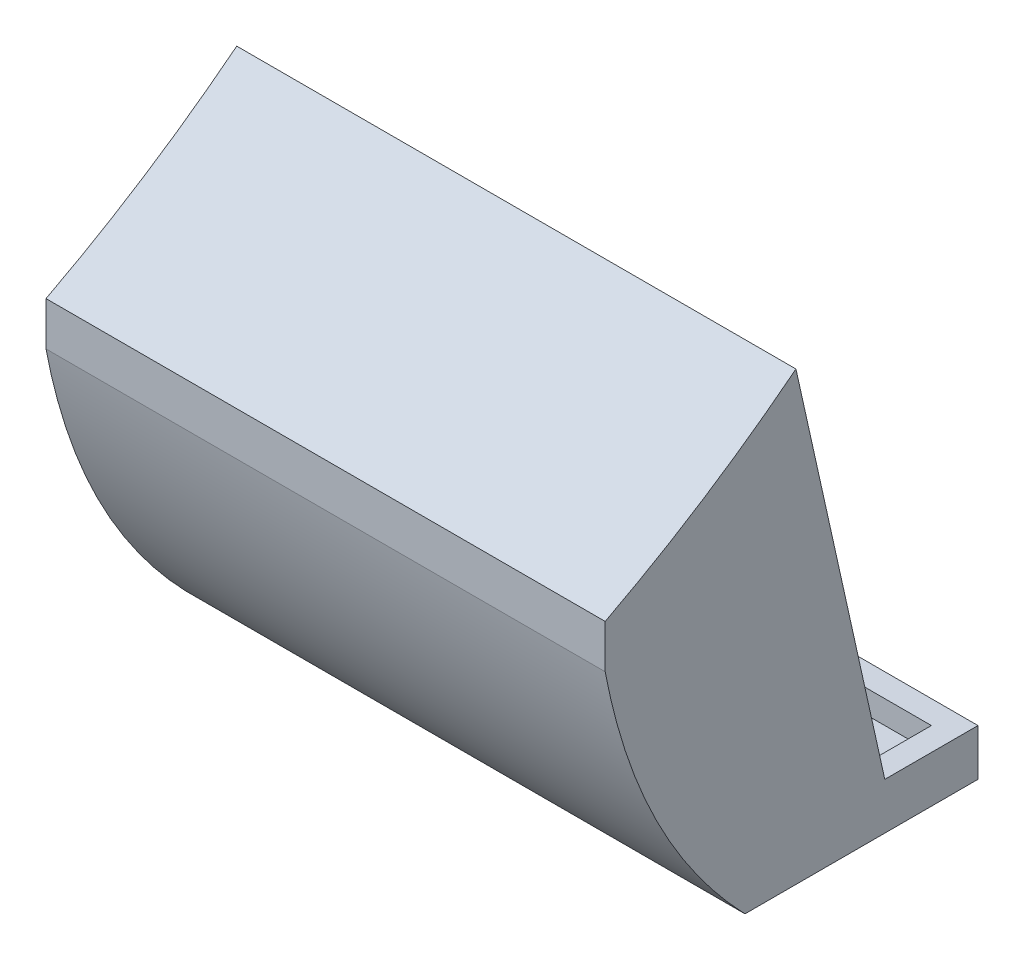
ISO-10303-21;
HEADER;
FILE_DESCRIPTION(('STEP AP214'),'2;1');
FILE_NAME('part.step','',(''),(''),'','','');
FILE_SCHEMA(('AUTOMOTIVE_DESIGN { 1 0 10303 214 1 1 1 1 }'));
ENDSEC;
DATA;
#1=APPLICATION_CONTEXT('core data for automotive mechanical design processes');
#2=APPLICATION_PROTOCOL_DEFINITION('international standard','automotive_design',2000,#1);
#3=PRODUCT_CONTEXT('',#1,'mechanical');
#4=PRODUCT('Part','Part','',(#3));
#5=PRODUCT_RELATED_PRODUCT_CATEGORY('part','',(#4));
#6=PRODUCT_DEFINITION_FORMATION('','',#4);
#7=PRODUCT_DEFINITION_CONTEXT('part definition',#1,'design');
#8=PRODUCT_DEFINITION('design','',#6,#7);
#9=PRODUCT_DEFINITION_SHAPE('','',#8);
#10=(LENGTH_UNIT() NAMED_UNIT(*) SI_UNIT(.MILLI.,.METRE.));
#11=(NAMED_UNIT(*) PLANE_ANGLE_UNIT() SI_UNIT($,.RADIAN.));
#12=(NAMED_UNIT(*) SI_UNIT($,.STERADIAN.) SOLID_ANGLE_UNIT());
#13=UNCERTAINTY_MEASURE_WITH_UNIT(LENGTH_MEASURE(1.E-05),#10,'distance_accuracy_value','');
#14=(GEOMETRIC_REPRESENTATION_CONTEXT(3) GLOBAL_UNCERTAINTY_ASSIGNED_CONTEXT((#13)) GLOBAL_UNIT_ASSIGNED_CONTEXT((#10,
#11,#12)) REPRESENTATION_CONTEXT('',''));
#15=CARTESIAN_POINT('',(0.,0.,0.));
#16=DIRECTION('',(0.,0.,1.));
#17=DIRECTION('',(1.,0.,0.));
#18=AXIS2_PLACEMENT_3D('',#15,#16,#17);
#19=CARTESIAN_POINT('',(0.,10.,-80.));
#20=DIRECTION('',(0.,-1.,0.));
#21=DIRECTION('',(0.,0.,-1.));
#22=AXIS2_PLACEMENT_3D('',#19,#20,#21);
#23=PLANE('',#22);
#24=DIRECTION('',(0.,0.,-1.));
#25=VECTOR('',#24,1.);
#26=CARTESIAN_POINT('',(115.,10.,-80.));
#27=LINE('',#26,#25);
#28=CARTESIAN_POINT('',(115.,9.99999999999999,-60.));
#29=VERTEX_POINT('',#28);
#30=CARTESIAN_POINT('',(115.,10.,-75.));
#31=VERTEX_POINT('',#30);
#32=EDGE_CURVE('E221',#29,#31,#27,.T.);
#33=ORIENTED_EDGE('',*,*,#32,.F.);
#34=DIRECTION('',(1.,0.,0.));
#35=VECTOR('',#34,1.);
#36=CARTESIAN_POINT('',(0.,9.99999999999999,-60.));
#37=LINE('',#36,#35);
#38=CARTESIAN_POINT('',(120.,9.99999999999999,-60.));
#39=VERTEX_POINT('',#38);
#40=EDGE_CURVE('E257',#29,#39,#37,.T.);
#41=ORIENTED_EDGE('',*,*,#40,.T.);
#42=DIRECTION('',(0.,0.,-1.));
#43=VECTOR('',#42,1.);
#44=CARTESIAN_POINT('',(120.,10.,-80.));
#45=LINE('',#44,#43);
#46=CARTESIAN_POINT('',(120.,10.,-80.));
#47=VERTEX_POINT('',#46);
#48=EDGE_CURVE('E254',#39,#47,#45,.T.);
#49=ORIENTED_EDGE('',*,*,#48,.T.);
#50=DIRECTION('',(1.,0.,0.));
#51=VECTOR('',#50,1.);
#52=CARTESIAN_POINT('',(0.,10.,-80.));
#53=LINE('',#52,#51);
#54=CARTESIAN_POINT('',(0.,10.,-80.));
#55=VERTEX_POINT('',#54);
#56=EDGE_CURVE('E242',#55,#47,#53,.T.);
#57=ORIENTED_EDGE('',*,*,#56,.F.);
#58=DIRECTION('',(0.,0.,-1.));
#59=VECTOR('',#58,1.);
#60=CARTESIAN_POINT('',(0.,10.,-80.));
#61=LINE('',#60,#59);
#62=CARTESIAN_POINT('',(0.,9.99999999999999,-60.));
#63=VERTEX_POINT('',#62);
#64=EDGE_CURVE('E253',#63,#55,#61,.T.);
#65=ORIENTED_EDGE('',*,*,#64,.F.);
#66=CARTESIAN_POINT('',(5.,9.99999999999999,-60.));
#67=VERTEX_POINT('',#66);
#68=EDGE_CURVE('E263',#63,#67,#37,.T.);
#69=ORIENTED_EDGE('',*,*,#68,.T.);
#70=DIRECTION('',(0.,0.,-1.));
#71=VECTOR('',#70,1.);
#72=CARTESIAN_POINT('',(5.,9.99999999999998,0.));
#73=LINE('',#72,#71);
#74=CARTESIAN_POINT('',(5.,10.,-75.));
#75=VERTEX_POINT('',#74);
#76=EDGE_CURVE('E220',#67,#75,#73,.T.);
#77=ORIENTED_EDGE('',*,*,#76,.T.);
#78=DIRECTION('',(1.,0.,0.));
#79=VECTOR('',#78,1.);
#80=CARTESIAN_POINT('',(0.,10.,-75.));
#81=LINE('',#80,#79);
#82=EDGE_CURVE('E159',#75,#31,#81,.T.);
#83=ORIENTED_EDGE('',*,*,#82,.T.);
#84=EDGE_LOOP('',(#33,#41,#49,#57,#65,#69,#77,#83));
#85=FACE_BOUND('',#84,.T.);
#86=ADVANCED_FACE('F33',(#85),#23,.F.);
#87=CARTESIAN_POINT('',(0.,100.,0.));
#88=DIRECTION('',(1.,0.,0.));
#89=DIRECTION('',(0.,0.,-1.));
#90=AXIS2_PLACEMENT_3D('',#87,#88,#89);
#91=PLANE('',#90);
#92=DIRECTION('',(0.,-1.,0.));
#93=VECTOR('',#92,1.);
#94=CARTESIAN_POINT('',(0.,100.,0.));
#95=LINE('',#94,#93);
#96=CARTESIAN_POINT('',(0.,69.3487481065839,0.));
#97=VERTEX_POINT('',#96);
#98=CARTESIAN_POINT('',(0.,60.,0.));
#99=VERTEX_POINT('',#98);
#100=EDGE_CURVE('E41',#97,#99,#95,.T.);
#101=ORIENTED_EDGE('',*,*,#100,.F.);
#102=CARTESIAN_POINT('',(0.,300.,120.));
#103=DIRECTION('',(1.,0.,0.));
#104=DIRECTION('',(0.,0.,-1.));
#105=AXIS2_PLACEMENT_3D('',#102,#103,#104);
#106=CIRCLE('',#105,260.);
#107=CARTESIAN_POINT('',(0.,95.7941195384905,-40.9346401025577));
#108=VERTEX_POINT('',#107);
#109=EDGE_CURVE('E230',#97,#108,#106,.T.);
#110=ORIENTED_EDGE('',*,*,#109,.T.);
#111=DIRECTION('',(0.,-0.976187060183953,-0.216930457818656));
#112=VECTOR('',#111,1.);
#113=CARTESIAN_POINT('',(0.,100.,-40.));
#114=LINE('',#113,#112);
#115=EDGE_CURVE('E251',#108,#63,#114,.T.);
#116=ORIENTED_EDGE('',*,*,#115,.T.);
#117=ORIENTED_EDGE('',*,*,#64,.T.);
#118=DIRECTION('',(0.,-1.,0.));
#119=VECTOR('',#118,1.);
#120=CARTESIAN_POINT('',(0.,100.,-80.));
#121=LINE('',#120,#119);
#122=CARTESIAN_POINT('',(0.,0.,-80.));
#123=VERTEX_POINT('',#122);
#124=EDGE_CURVE('E274',#55,#123,#121,.T.);
#125=ORIENTED_EDGE('',*,*,#124,.T.);
#126=DIRECTION('',(0.,0.,1.));
#127=VECTOR('',#126,1.);
#128=CARTESIAN_POINT('',(0.,0.,0.));
#129=LINE('',#128,#127);
#130=CARTESIAN_POINT('',(0.,0.,-30.));
#131=VERTEX_POINT('',#130);
#132=EDGE_CURVE('E248',#123,#131,#129,.T.);
#133=ORIENTED_EDGE('',*,*,#132,.T.);
#134=CARTESIAN_POINT('',(0.,0.,-30.));
#135=CARTESIAN_POINT('',(0.,24.0537588250058,-6.79745445101633));
#136=CARTESIAN_POINT('',(0.,60.,0.));
#137=B_SPLINE_CURVE_WITH_KNOTS('',2,(#134,#135,#136),.UNSPECIFIED.,.F.,.F.,(3,3),(0.,
0.9272023084187),.UNSPECIFIED.);
#138=EDGE_CURVE('E189',#131,#99,#137,.T.);
#139=ORIENTED_EDGE('',*,*,#138,.T.);
#140=EDGE_LOOP('',(#101,#110,#116,#117,#125,#133,#139));
#141=FACE_BOUND('',#140,.T.);
#142=ADVANCED_FACE('F35',(#141),#91,.F.);
#143=CARTESIAN_POINT('',(0.,100.,0.));
#144=DIRECTION('',(0.,0.,-1.));
#145=DIRECTION('',(-1.,0.,0.));
#146=AXIS2_PLACEMENT_3D('',#143,#144,#145);
#147=PLANE('',#146);
#148=DIRECTION('',(0.,-1.,0.));
#149=VECTOR('',#148,1.);
#150=CARTESIAN_POINT('',(120.,100.,0.));
#151=LINE('',#150,#149);
#152=CARTESIAN_POINT('',(120.,69.3487481065839,0.));
#153=VERTEX_POINT('',#152);
#154=CARTESIAN_POINT('',(120.,60.,0.));
#155=VERTEX_POINT('',#154);
#156=EDGE_CURVE('E278',#153,#155,#151,.T.);
#157=ORIENTED_EDGE('',*,*,#156,.F.);
#158=DIRECTION('',(1.,0.,0.));
#159=VECTOR('',#158,1.);
#160=CARTESIAN_POINT('',(0.,69.348748106584,0.));
#161=LINE('',#160,#159);
#162=EDGE_CURVE('E233',#153,#97,#161,.F.);
#163=ORIENTED_EDGE('',*,*,#162,.T.);
#164=ORIENTED_EDGE('',*,*,#100,.T.);
#165=DIRECTION('',(1.,0.,0.));
#166=VECTOR('',#165,1.);
#167=CARTESIAN_POINT('',(0.,60.,0.));
#168=LINE('',#167,#166);
#169=EDGE_CURVE('E194',#99,#155,#168,.T.);
#170=ORIENTED_EDGE('',*,*,#169,.T.);
#171=EDGE_LOOP('',(#157,#163,#164,#170));
#172=FACE_BOUND('',#171,.T.);
#173=ADVANCED_FACE('F283',(#172),#147,.F.);
#174=CARTESIAN_POINT('',(120.,100.,0.));
#175=DIRECTION('',(-1.,0.,0.));
#176=DIRECTION('',(0.,0.,1.));
#177=AXIS2_PLACEMENT_3D('',#174,#175,#176);
#178=PLANE('',#177);
#179=DIRECTION('',(0.,-0.976187060183953,-0.216930457818656));
#180=VECTOR('',#179,1.);
#181=CARTESIAN_POINT('',(120.,100.,-40.));
#182=LINE('',#181,#180);
#183=CARTESIAN_POINT('',(120.,95.7941195384905,-40.9346401025577));
#184=VERTEX_POINT('',#183);
#185=EDGE_CURVE('E237',#184,#39,#182,.T.);
#186=ORIENTED_EDGE('',*,*,#185,.F.);
#187=CARTESIAN_POINT('',(120.,300.,120.));
#188=DIRECTION('',(1.,0.,0.));
#189=DIRECTION('',(0.,0.,-1.));
#190=AXIS2_PLACEMENT_3D('',#187,#188,#189);
#191=CIRCLE('',#190,260.);
#192=EDGE_CURVE('E56',#153,#184,#191,.T.);
#193=ORIENTED_EDGE('',*,*,#192,.F.);
#194=ORIENTED_EDGE('',*,*,#156,.T.);
#195=CARTESIAN_POINT('',(120.,0.,-30.));
#196=CARTESIAN_POINT('',(120.,24.0537588250058,-6.79745445101633));
#197=CARTESIAN_POINT('',(120.,60.,0.));
#198=B_SPLINE_CURVE_WITH_KNOTS('',2,(#195,#196,#197),.UNSPECIFIED.,.F.,.F.,(3,3),(0.,
0.9272023084187),.UNSPECIFIED.);
#199=CARTESIAN_POINT('',(120.,0.,-30.));
#200=VERTEX_POINT('',#199);
#201=EDGE_CURVE('E195',#200,#155,#198,.T.);
#202=ORIENTED_EDGE('',*,*,#201,.F.);
#203=DIRECTION('',(0.,0.,-1.));
#204=VECTOR('',#203,1.);
#205=CARTESIAN_POINT('',(120.,0.,0.));
#206=LINE('',#205,#204);
#207=CARTESIAN_POINT('',(120.,0.,-80.));
#208=VERTEX_POINT('',#207);
#209=EDGE_CURVE('E268',#200,#208,#206,.T.);
#210=ORIENTED_EDGE('',*,*,#209,.T.);
#211=DIRECTION('',(0.,-1.,0.));
#212=VECTOR('',#211,1.);
#213=CARTESIAN_POINT('',(120.,100.,-80.));
#214=LINE('',#213,#212);
#215=EDGE_CURVE('E276',#47,#208,#214,.T.);
#216=ORIENTED_EDGE('',*,*,#215,.F.);
#217=ORIENTED_EDGE('',*,*,#48,.F.);
#218=EDGE_LOOP('',(#186,#193,#194,#202,#210,#216,#217));
#219=FACE_BOUND('',#218,.T.);
#220=ADVANCED_FACE('F294',(#219),#178,.F.);
#221=CARTESIAN_POINT('',(0.,100.,-80.));
#222=DIRECTION('',(0.,0.,1.));
#223=DIRECTION('',(1.,0.,0.));
#224=AXIS2_PLACEMENT_3D('',#221,#222,#223);
#225=PLANE('',#224);
#226=ORIENTED_EDGE('',*,*,#124,.F.);
#227=ORIENTED_EDGE('',*,*,#56,.T.);
#228=ORIENTED_EDGE('',*,*,#215,.T.);
#229=DIRECTION('',(-1.,0.,0.));
#230=VECTOR('',#229,1.);
#231=CARTESIAN_POINT('',(0.,0.,-80.));
#232=LINE('',#231,#230);
#233=EDGE_CURVE('E271',#208,#123,#232,.T.);
#234=ORIENTED_EDGE('',*,*,#233,.T.);
#235=EDGE_LOOP('',(#226,#227,#228,#234));
#236=FACE_BOUND('',#235,.T.);
#237=ADVANCED_FACE('F307',(#236),#225,.F.);
#238=CARTESIAN_POINT('',(0.,0.,0.));
#239=DIRECTION('',(0.,-1.,0.));
#240=DIRECTION('',(0.,0.,-1.));
#241=AXIS2_PLACEMENT_3D('',#238,#239,#240);
#242=PLANE('',#241);
#243=DIRECTION('',(1.,0.,0.));
#244=VECTOR('',#243,1.);
#245=CARTESIAN_POINT('',(0.,0.,-30.));
#246=LINE('',#245,#244);
#247=EDGE_CURVE('E243',#131,#200,#246,.T.);
#248=ORIENTED_EDGE('',*,*,#247,.F.);
#249=ORIENTED_EDGE('',*,*,#132,.F.);
#250=ORIENTED_EDGE('',*,*,#233,.F.);
#251=ORIENTED_EDGE('',*,*,#209,.F.);
#252=EDGE_LOOP('',(#248,#249,#250,#251));
#253=FACE_BOUND('',#252,.T.);
#254=ADVANCED_FACE('F187',(#253),#242,.T.);
#255=DIRECTION('',(1.,0.,0.));
#256=VECTOR('',#255,1.);
#257=SURFACE_OF_LINEAR_EXTRUSION('',#137,#256);
#258=ORIENTED_EDGE('',*,*,#201,.T.);
#259=ORIENTED_EDGE('',*,*,#169,.F.);
#260=ORIENTED_EDGE('',*,*,#138,.F.);
#261=ORIENTED_EDGE('',*,*,#247,.T.);
#262=EDGE_LOOP('',(#258,#259,#260,#261));
#263=FACE_BOUND('',#262,.T.);
#264=ADVANCED_FACE('F182',(#263),#257,.F.);
#265=CARTESIAN_POINT('',(0.,100.,-40.));
#266=DIRECTION('',(0.,-0.216930457818656,0.976187060183953));
#267=DIRECTION('',(0.,-0.976187060183953,-0.216930457818656));
#268=AXIS2_PLACEMENT_3D('',#265,#266,#267);
#269=PLANE('',#268);
#270=DIRECTION('',(1.,0.,0.));
#271=VECTOR('',#270,1.);
#272=CARTESIAN_POINT('',(5.,90.3885557683072,-42.1358764959317));
#273=LINE('',#272,#271);
#274=CARTESIAN_POINT('',(5.,90.3885557683072,-42.1358764959317));
#275=VERTEX_POINT('',#274);
#276=CARTESIAN_POINT('',(115.,90.3885557683072,-42.1358764959317));
#277=VERTEX_POINT('',#276);
#278=EDGE_CURVE('E48',#275,#277,#273,.T.);
#279=ORIENTED_EDGE('',*,*,#278,.F.);
#280=DIRECTION('',(0.,-0.976187060183953,-0.216930457818656));
#281=VECTOR('',#280,1.);
#282=CARTESIAN_POINT('',(5.,108.470588235294,-38.1176470588235));
#283=LINE('',#282,#281);
#284=EDGE_CURVE('E217',#275,#67,#283,.T.);
#285=ORIENTED_EDGE('',*,*,#284,.T.);
#286=ORIENTED_EDGE('',*,*,#68,.F.);
#287=ORIENTED_EDGE('',*,*,#115,.F.);
#288=DIRECTION('',(1.,0.,0.));
#289=VECTOR('',#288,1.);
#290=CARTESIAN_POINT('',(0.,95.7941195384905,-40.9346401025577));
#291=LINE('',#290,#289);
#292=EDGE_CURVE('E11',#108,#184,#291,.T.);
#293=ORIENTED_EDGE('',*,*,#292,.T.);
#294=ORIENTED_EDGE('',*,*,#185,.T.);
#295=ORIENTED_EDGE('',*,*,#40,.F.);
#296=DIRECTION('',(0.,-0.976187060183953,-0.216930457818656));
#297=VECTOR('',#296,1.);
#298=CARTESIAN_POINT('',(115.,100.,-40.));
#299=LINE('',#298,#297);
#300=EDGE_CURVE('E223',#277,#29,#299,.T.);
#301=ORIENTED_EDGE('',*,*,#300,.F.);
#302=EDGE_LOOP('',(#279,#285,#286,#287,#293,#294,#295,#301));
#303=FACE_BOUND('',#302,.T.);
#304=ADVANCED_FACE('F186',(#303),#269,.F.);
#305=CARTESIAN_POINT('',(0.,300.,120.));
#306=DIRECTION('',(1.,0.,0.));
#307=DIRECTION('',(0.,0.,-1.));
#308=AXIS2_PLACEMENT_3D('',#305,#306,#307);
#309=CYLINDRICAL_SURFACE('',#308,260.);
#310=ORIENTED_EDGE('',*,*,#192,.T.);
#311=ORIENTED_EDGE('',*,*,#292,.F.);
#312=ORIENTED_EDGE('',*,*,#109,.F.);
#313=ORIENTED_EDGE('',*,*,#162,.F.);
#314=EDGE_LOOP('',(#310,#311,#312,#313));
#315=FACE_BOUND('',#314,.T.);
#316=ADVANCED_FACE('F302',(#315),#309,.F.);
#317=CARTESIAN_POINT('',(5.,100.,0.));
#318=DIRECTION('',(1.,0.,0.));
#319=DIRECTION('',(0.,0.,-1.));
#320=AXIS2_PLACEMENT_3D('',#317,#318,#319);
#321=PLANE('',#320);
#322=DIRECTION('',(0.,-1.,0.));
#323=VECTOR('',#322,1.);
#324=CARTESIAN_POINT('',(5.,100.,-5.));
#325=LINE('',#324,#323);
#326=CARTESIAN_POINT('',(5.,66.3335710890414,-5.));
#327=VERTEX_POINT('',#326);
#328=CARTESIAN_POINT('',(5.,60.4727232480705,-5.));
#329=VERTEX_POINT('',#328);
#330=EDGE_CURVE('E133',#327,#329,#325,.T.);
#331=ORIENTED_EDGE('',*,*,#330,.T.);
#332=CARTESIAN_POINT('',(5.,5.,-32.153020450357));
#333=CARTESIAN_POINT('',(5.,5.78351738037098,-31.4266913091146));
#334=CARTESIAN_POINT('',(5.,6.57810648607348,-30.7122933076183));
#335=CARTESIAN_POINT('',(5.,8.18884802870465,-29.3081949638553));
#336=CARTESIAN_POINT('',(5.,9.00500101033703,-28.6184952465059));
#337=CARTESIAN_POINT('',(5.,10.6582549120653,-27.2646620562085));
#338=CARTESIAN_POINT('',(5.,11.4953559438592,-26.600528719632));
#339=CARTESIAN_POINT('',(5.,13.1882176366177,-25.2997752962394));
#340=CARTESIAN_POINT('',(5.,14.0439411192044,-24.6631068213443));
#341=CARTESIAN_POINT('',(5.,15.7747254217688,-23.4166419707587));
#342=CARTESIAN_POINT('',(5.,16.6497859432661,-22.8068451807197));
#343=CARTESIAN_POINT('',(5.,18.4183428627615,-21.614671895199));
#344=CARTESIAN_POINT('',(5.,19.3118388531157,-21.0322947943475));
#345=CARTESIAN_POINT('',(5.,21.4741547298392,-19.6699450648846));
#346=CARTESIAN_POINT('',(5.,22.751326027207,-18.9031794510423));
#347=CARTESIAN_POINT('',(5.,25.3372987709036,-17.4246073766556));
#348=CARTESIAN_POINT('',(5.,26.6461048823155,-16.7128090876915));
#349=CARTESIAN_POINT('',(5.,29.2934465760581,-15.3440186381849));
#350=CARTESIAN_POINT('',(5.,30.632006228464,-14.6870730593746));
#351=CARTESIAN_POINT('',(5.,33.3347274299039,-13.4286154612036));
#352=CARTESIAN_POINT('',(5.,34.6988856668288,-12.8270963291312));
#353=CARTESIAN_POINT('',(5.,37.0551716683596,-11.8436835587649));
#354=CARTESIAN_POINT('',(5.,38.0417024493465,-11.4483055777116));
#355=CARTESIAN_POINT('',(5.,40.025467361507,-10.6850657703607));
#356=CARTESIAN_POINT('',(5.,41.0227025023984,-10.3172065663963));
#357=CARTESIAN_POINT('',(5.,43.0269076808401,-9.608622752027));
#358=CARTESIAN_POINT('',(5.,44.0338790166091,-9.26790181777536));
#359=CARTESIAN_POINT('',(5.,46.0565906577635,-8.61315142859062));
#360=CARTESIAN_POINT('',(5.,47.0723320065467,-8.29912519919456));
#361=CARTESIAN_POINT('',(5.,49.1107912654761,-7.69751435883436));
#362=CARTESIAN_POINT('',(5.,50.1335034610346,-7.40991036616919));
#363=CARTESIAN_POINT('',(5.,52.1856999761716,-6.86033383700735));
#364=CARTESIAN_POINT('',(5.,53.2151837602364,-6.59835929907277));
#365=CARTESIAN_POINT('',(5.,55.2799188239024,-6.09946952991108));
#366=CARTESIAN_POINT('',(5.,56.3151685685362,-5.86254793623674));
#367=CARTESIAN_POINT('',(5.,58.3904359723144,-5.41314832880688));
#368=CARTESIAN_POINT('',(5.,59.4304510674598,-5.20065848191091));
#369=CARTESIAN_POINT('',(5.,60.4727232480705,-5.));
#370=B_SPLINE_CURVE_WITH_KNOTS('',3,(#332,#333,#334,#335,#336,#337,#338,#339,#340,#341,#342,
#343,#344,#345,#346,#347,#348,#349,#350,#351,#352,#353,#354,#355,#356,#357,#358,#359,#360,#361,
#362,#363,#364,#365,#366,#367,#368,#369),.UNSPECIFIED.,.F.,.F.,(4,2,2,2,2,2,2,2,2,2,2,2,2,2,2,2,
2,2,4),(0.,3.20505344748554,6.4101879321996,9.61533951079112,12.8145920520314,16.0137952450705,
19.2129277731955,23.6804779327702,28.1486909760655,32.6206606964092,37.0920557405684,
40.2801018853978,43.4684514411787,46.6572321592491,49.8463976335338,53.0332047380383,
56.2197627815953,59.4055096132271,62.5897069192738),.UNSPECIFIED.);
#371=CARTESIAN_POINT('',(5.,5.,-32.153020450357));
#372=VERTEX_POINT('',#371);
#373=EDGE_CURVE('E138',#372,#329,#370,.T.);
#374=ORIENTED_EDGE('',*,*,#373,.F.);
#375=DIRECTION('',(0.,0.,1.));
#376=VECTOR('',#375,1.);
#377=CARTESIAN_POINT('',(5.,5.,0.));
#378=LINE('',#377,#376);
#379=CARTESIAN_POINT('',(5.,5.,-75.));
#380=VERTEX_POINT('',#379);
#381=EDGE_CURVE('E168',#380,#372,#378,.T.);
#382=ORIENTED_EDGE('',*,*,#381,.F.);
#383=DIRECTION('',(0.,-1.,0.));
#384=VECTOR('',#383,1.);
#385=CARTESIAN_POINT('',(5.,100.,-75.));
#386=LINE('',#385,#384);
#387=EDGE_CURVE('E202',#75,#380,#386,.T.);
#388=ORIENTED_EDGE('',*,*,#387,.F.);
#389=ORIENTED_EDGE('',*,*,#76,.F.);
#390=ORIENTED_EDGE('',*,*,#284,.F.);
#391=CARTESIAN_POINT('',(5.,300.,120.));
#392=DIRECTION('',(1.,0.,0.));
#393=DIRECTION('',(0.,0.,-1.));
#394=AXIS2_PLACEMENT_3D('',#391,#392,#393);
#395=CIRCLE('',#394,265.);
#396=EDGE_CURVE('E141',#327,#275,#395,.T.);
#397=ORIENTED_EDGE('',*,*,#396,.F.);
#398=EDGE_LOOP('',(#331,#374,#382,#388,#389,#390,#397));
#399=FACE_BOUND('',#398,.T.);
#400=ADVANCED_FACE('F135',(#399),#321,.T.);
#401=CARTESIAN_POINT('',(0.,100.,-5.));
#402=DIRECTION('',(0.,0.,-1.));
#403=DIRECTION('',(-1.,0.,0.));
#404=AXIS2_PLACEMENT_3D('',#401,#402,#403);
#405=PLANE('',#404);
#406=DIRECTION('',(0.,-1.,0.));
#407=VECTOR('',#406,1.);
#408=CARTESIAN_POINT('',(115.,100.,-5.));
#409=LINE('',#408,#407);
#410=CARTESIAN_POINT('',(115.,66.3335710890414,-5.));
#411=VERTEX_POINT('',#410);
#412=CARTESIAN_POINT('',(115.,60.4727232480705,-5.));
#413=VERTEX_POINT('',#412);
#414=EDGE_CURVE('E144',#411,#413,#409,.T.);
#415=ORIENTED_EDGE('',*,*,#414,.T.);
#416=DIRECTION('',(1.,0.,0.));
#417=VECTOR('',#416,1.);
#418=CARTESIAN_POINT('',(5.,60.4727232480705,-5.));
#419=LINE('',#418,#417);
#420=EDGE_CURVE('E147',#329,#413,#419,.T.);
#421=ORIENTED_EDGE('',*,*,#420,.F.);
#422=ORIENTED_EDGE('',*,*,#330,.F.);
#423=DIRECTION('',(1.,0.,0.));
#424=VECTOR('',#423,1.);
#425=CARTESIAN_POINT('',(115.,66.3335710890414,-5.));
#426=LINE('',#425,#424);
#427=EDGE_CURVE('E200',#411,#327,#426,.F.);
#428=ORIENTED_EDGE('',*,*,#427,.F.);
#429=EDGE_LOOP('',(#415,#421,#422,#428));
#430=FACE_BOUND('',#429,.T.);
#431=ADVANCED_FACE('F148',(#430),#405,.T.);
#432=CARTESIAN_POINT('',(115.,100.,0.));
#433=DIRECTION('',(-1.,0.,0.));
#434=DIRECTION('',(0.,0.,1.));
#435=AXIS2_PLACEMENT_3D('',#432,#433,#434);
#436=PLANE('',#435);
#437=ORIENTED_EDGE('',*,*,#300,.T.);
#438=ORIENTED_EDGE('',*,*,#32,.T.);
#439=DIRECTION('',(0.,-1.,0.));
#440=VECTOR('',#439,1.);
#441=CARTESIAN_POINT('',(115.,100.,-75.));
#442=LINE('',#441,#440);
#443=CARTESIAN_POINT('',(115.,5.,-75.));
#444=VERTEX_POINT('',#443);
#445=EDGE_CURVE('E203',#31,#444,#442,.T.);
#446=ORIENTED_EDGE('',*,*,#445,.T.);
#447=DIRECTION('',(0.,0.,-1.));
#448=VECTOR('',#447,1.);
#449=CARTESIAN_POINT('',(115.,5.,0.));
#450=LINE('',#449,#448);
#451=CARTESIAN_POINT('',(115.,5.,-32.153020450357));
#452=VERTEX_POINT('',#451);
#453=EDGE_CURVE('E210',#452,#444,#450,.T.);
#454=ORIENTED_EDGE('',*,*,#453,.F.);
#455=CARTESIAN_POINT('',(115.,5.,-32.153020450357));
#456=CARTESIAN_POINT('',(115.,5.78351738037098,-31.4266913091146));
#457=CARTESIAN_POINT('',(115.,6.57810648607348,-30.7122933076183));
#458=CARTESIAN_POINT('',(115.,8.18884802870465,-29.3081949638553));
#459=CARTESIAN_POINT('',(115.,9.00500101033703,-28.6184952465059));
#460=CARTESIAN_POINT('',(115.,10.6582549120653,-27.2646620562085));
#461=CARTESIAN_POINT('',(115.,11.4953559438592,-26.600528719632));
#462=CARTESIAN_POINT('',(115.,13.1882176366177,-25.2997752962394));
#463=CARTESIAN_POINT('',(115.,14.0439411192044,-24.6631068213443));
#464=CARTESIAN_POINT('',(115.,15.7747254217688,-23.4166419707587));
#465=CARTESIAN_POINT('',(115.,16.6497859432661,-22.8068451807197));
#466=CARTESIAN_POINT('',(115.,18.4183428627615,-21.614671895199));
#467=CARTESIAN_POINT('',(115.,19.3118388531157,-21.0322947943475));
#468=CARTESIAN_POINT('',(115.,21.4741547298392,-19.6699450648846));
#469=CARTESIAN_POINT('',(115.,22.751326027207,-18.9031794510423));
#470=CARTESIAN_POINT('',(115.,25.3372987709036,-17.4246073766556));
#471=CARTESIAN_POINT('',(115.,26.6461048823155,-16.7128090876915));
#472=CARTESIAN_POINT('',(115.,29.2934465760581,-15.3440186381849));
#473=CARTESIAN_POINT('',(115.,30.632006228464,-14.6870730593746));
#474=CARTESIAN_POINT('',(115.,33.3347274299039,-13.4286154612036));
#475=CARTESIAN_POINT('',(115.,34.6988856668288,-12.8270963291312));
#476=CARTESIAN_POINT('',(115.,37.0551716683596,-11.8436835587649));
#477=CARTESIAN_POINT('',(115.,38.0417024493465,-11.4483055777116));
#478=CARTESIAN_POINT('',(115.,40.025467361507,-10.6850657703607));
#479=CARTESIAN_POINT('',(115.,41.0227025023984,-10.3172065663963));
#480=CARTESIAN_POINT('',(115.,43.0269076808401,-9.608622752027));
#481=CARTESIAN_POINT('',(115.,44.0338790166091,-9.26790181777536));
#482=CARTESIAN_POINT('',(115.,46.0565906577635,-8.61315142859062));
#483=CARTESIAN_POINT('',(115.,47.0723320065467,-8.29912519919456));
#484=CARTESIAN_POINT('',(115.,49.1107912654761,-7.69751435883436));
#485=CARTESIAN_POINT('',(115.,50.1335034610346,-7.40991036616919));
#486=CARTESIAN_POINT('',(115.,52.1856999761716,-6.86033383700735));
#487=CARTESIAN_POINT('',(115.,53.2151837602364,-6.59835929907277));
#488=CARTESIAN_POINT('',(115.,55.2799188239024,-6.09946952991108));
#489=CARTESIAN_POINT('',(115.,56.3151685685362,-5.86254793623674));
#490=CARTESIAN_POINT('',(115.,58.3904359723144,-5.41314832880688));
#491=CARTESIAN_POINT('',(115.,59.4304510674598,-5.20065848191091));
#492=CARTESIAN_POINT('',(115.,60.4727232480705,-5.));
#493=B_SPLINE_CURVE_WITH_KNOTS('',3,(#455,#456,#457,#458,#459,#460,#461,#462,#463,#464,#465,
#466,#467,#468,#469,#470,#471,#472,#473,#474,#475,#476,#477,#478,#479,#480,#481,#482,#483,#484,
#485,#486,#487,#488,#489,#490,#491,#492),.UNSPECIFIED.,.F.,.F.,(4,2,2,2,2,2,2,2,2,2,2,2,2,2,2,2,
2,2,4),(0.,3.20505344748554,6.4101879321996,9.61533951079112,12.8145920520314,16.0137952450705,
19.2129277731955,23.6804779327702,28.1486909760655,32.6206606964092,37.0920557405684,
40.2801018853978,43.4684514411787,46.6572321592491,49.8463976335338,53.0332047380383,
56.2197627815953,59.4055096132271,62.5897069192738),.UNSPECIFIED.);
#494=EDGE_CURVE('E157',#452,#413,#493,.T.);
#495=ORIENTED_EDGE('',*,*,#494,.T.);
#496=ORIENTED_EDGE('',*,*,#414,.F.);
#497=CARTESIAN_POINT('',(115.,300.,120.));
#498=DIRECTION('',(-1.,0.,0.));
#499=DIRECTION('',(0.,0.,1.));
#500=AXIS2_PLACEMENT_3D('',#497,#498,#499);
#501=CIRCLE('',#500,265.);
#502=EDGE_CURVE('E201',#411,#277,#501,.F.);
#503=ORIENTED_EDGE('',*,*,#502,.T.);
#504=EDGE_LOOP('',(#437,#438,#446,#454,#495,#496,#503));
#505=FACE_BOUND('',#504,.T.);
#506=ADVANCED_FACE('F178',(#505),#436,.T.);
#507=CARTESIAN_POINT('',(0.,100.,-75.));
#508=DIRECTION('',(0.,0.,1.));
#509=DIRECTION('',(1.,0.,0.));
#510=AXIS2_PLACEMENT_3D('',#507,#508,#509);
#511=PLANE('',#510);
#512=ORIENTED_EDGE('',*,*,#387,.T.);
#513=DIRECTION('',(-1.,0.,0.));
#514=VECTOR('',#513,1.);
#515=CARTESIAN_POINT('',(0.,5.,-75.));
#516=LINE('',#515,#514);
#517=EDGE_CURVE('E204',#444,#380,#516,.T.);
#518=ORIENTED_EDGE('',*,*,#517,.F.);
#519=ORIENTED_EDGE('',*,*,#445,.F.);
#520=ORIENTED_EDGE('',*,*,#82,.F.);
#521=EDGE_LOOP('',(#512,#518,#519,#520));
#522=FACE_BOUND('',#521,.T.);
#523=ADVANCED_FACE('F337',(#522),#511,.T.);
#524=CARTESIAN_POINT('',(0.,5.,0.));
#525=DIRECTION('',(0.,-1.,0.));
#526=DIRECTION('',(0.,0.,-1.));
#527=AXIS2_PLACEMENT_3D('',#524,#525,#526);
#528=PLANE('',#527);
#529=DIRECTION('',(1.,0.,0.));
#530=VECTOR('',#529,1.);
#531=CARTESIAN_POINT('',(5.,5.,-32.153020450357));
#532=LINE('',#531,#530);
#533=EDGE_CURVE('E153',#372,#452,#532,.T.);
#534=ORIENTED_EDGE('',*,*,#533,.T.);
#535=ORIENTED_EDGE('',*,*,#453,.T.);
#536=ORIENTED_EDGE('',*,*,#517,.T.);
#537=ORIENTED_EDGE('',*,*,#381,.T.);
#538=EDGE_LOOP('',(#534,#535,#536,#537));
#539=FACE_BOUND('',#538,.T.);
#540=ADVANCED_FACE('F177',(#539),#528,.F.);
#541=CARTESIAN_POINT('',(0.,0.,-30.));
#542=CARTESIAN_POINT('',(0.,24.0537588250058,-6.79745445101633));
#543=CARTESIAN_POINT('',(0.,60.,0.));
#544=B_SPLINE_CURVE_WITH_KNOTS('',2,(#541,#542,#543),.UNSPECIFIED.,.F.,.F.,(3,3),(0.,
0.9272023084187),.UNSPECIFIED.);
#545=DIRECTION('',(1.,0.,0.));
#546=VECTOR('',#545,1.);
#547=SURFACE_OF_LINEAR_EXTRUSION('',#544,#546);
#548=OFFSET_SURFACE('',#547,5.,.F.);
#549=ORIENTED_EDGE('',*,*,#494,.F.);
#550=ORIENTED_EDGE('',*,*,#533,.F.);
#551=ORIENTED_EDGE('',*,*,#373,.T.);
#552=ORIENTED_EDGE('',*,*,#420,.T.);
#553=EDGE_LOOP('',(#549,#550,#551,#552));
#554=FACE_BOUND('',#553,.T.);
#555=ADVANCED_FACE('F155',(#554),#548,.T.);
#556=CARTESIAN_POINT('',(0.,300.,120.));
#557=DIRECTION('',(1.,0.,0.));
#558=DIRECTION('',(0.,0.,-1.));
#559=AXIS2_PLACEMENT_3D('',#556,#557,#558);
#560=CYLINDRICAL_SURFACE('',#559,265.);
#561=ORIENTED_EDGE('',*,*,#502,.F.);
#562=ORIENTED_EDGE('',*,*,#427,.T.);
#563=ORIENTED_EDGE('',*,*,#396,.T.);
#564=ORIENTED_EDGE('',*,*,#278,.T.);
#565=EDGE_LOOP('',(#561,#562,#563,#564));
#566=FACE_BOUND('',#565,.T.);
#567=ADVANCED_FACE('F176',(#566),#560,.T.);
#568=CLOSED_SHELL('',(#86,#142,#173,#220,#237,#254,#264,#304,#316,#400,#431,#506,#523,#540,#555,#567));
#569=MANIFOLD_SOLID_BREP('B2',#568);
#570=ADVANCED_BREP_SHAPE_REPRESENTATION('',(#18,#569),#14);
#571=SHAPE_DEFINITION_REPRESENTATION(#9,#570);
ENDSEC;
END-ISO-10303-21;
